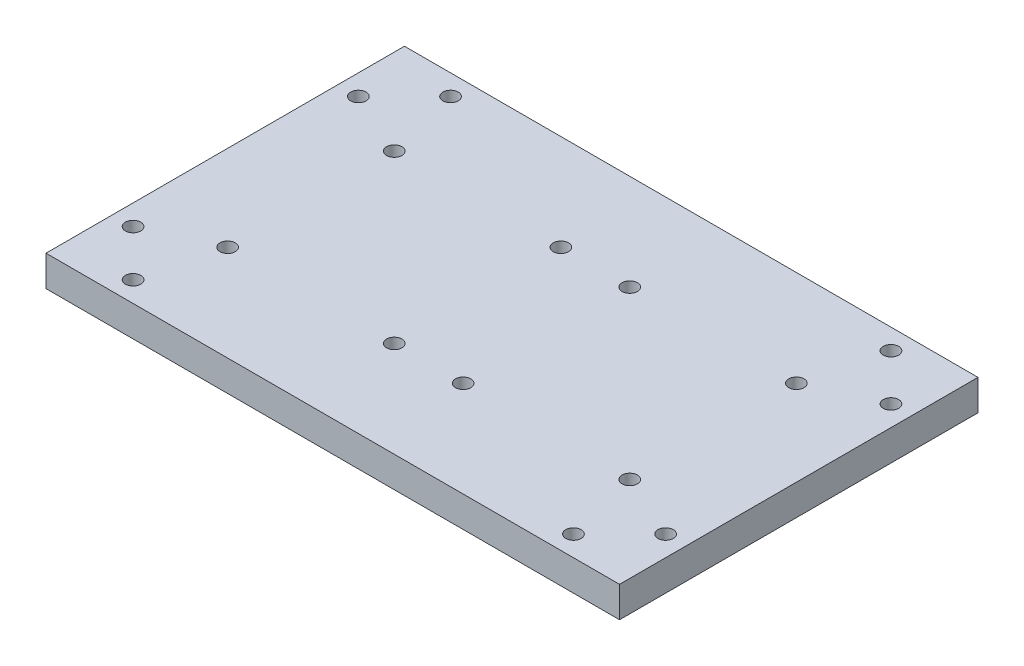
ISO-10303-21;
HEADER;
FILE_DESCRIPTION(('STEP AP214'),'2;1');
FILE_NAME('part.step','',(''),(''),'','','');
FILE_SCHEMA(('AUTOMOTIVE_DESIGN { 1 0 10303 214 1 1 1 1 }'));
ENDSEC;
DATA;
#1=APPLICATION_CONTEXT('core data for automotive mechanical design processes');
#2=APPLICATION_PROTOCOL_DEFINITION('international standard','automotive_design',2000,#1);
#3=PRODUCT_CONTEXT('',#1,'mechanical');
#4=PRODUCT('Part','Part','',(#3));
#5=PRODUCT_RELATED_PRODUCT_CATEGORY('part','',(#4));
#6=PRODUCT_DEFINITION_FORMATION('','',#4);
#7=PRODUCT_DEFINITION_CONTEXT('part definition',#1,'design');
#8=PRODUCT_DEFINITION('design','',#6,#7);
#9=PRODUCT_DEFINITION_SHAPE('','',#8);
#10=(LENGTH_UNIT() NAMED_UNIT(*) SI_UNIT(.MILLI.,.METRE.));
#11=(NAMED_UNIT(*) PLANE_ANGLE_UNIT() SI_UNIT($,.RADIAN.));
#12=(NAMED_UNIT(*) SI_UNIT($,.STERADIAN.) SOLID_ANGLE_UNIT());
#13=UNCERTAINTY_MEASURE_WITH_UNIT(LENGTH_MEASURE(1.E-05),#10,'distance_accuracy_value','');
#14=(GEOMETRIC_REPRESENTATION_CONTEXT(3) GLOBAL_UNCERTAINTY_ASSIGNED_CONTEXT((#13)) GLOBAL_UNIT_ASSIGNED_CONTEXT((#10,
#11,#12)) REPRESENTATION_CONTEXT('',''));
#15=CARTESIAN_POINT('',(0.,0.,0.));
#16=DIRECTION('',(0.,0.,1.));
#17=DIRECTION('',(1.,0.,0.));
#18=AXIS2_PLACEMENT_3D('',#15,#16,#17);
#19=CARTESIAN_POINT('',(0.,6.,0.));
#20=DIRECTION('',(1.,0.,0.));
#21=DIRECTION('',(0.,0.,-1.));
#22=AXIS2_PLACEMENT_3D('',#19,#20,#21);
#23=PLANE('',#22);
#24=DIRECTION('',(0.,0.,1.));
#25=VECTOR('',#24,1.);
#26=CARTESIAN_POINT('',(0.,0.,0.));
#27=LINE('',#26,#25);
#28=CARTESIAN_POINT('',(0.,0.,-70.));
#29=VERTEX_POINT('',#28);
#30=CARTESIAN_POINT('',(0.,0.,0.));
#31=VERTEX_POINT('',#30);
#32=EDGE_CURVE('E117',#29,#31,#27,.T.);
#33=ORIENTED_EDGE('',*,*,#32,.T.);
#34=DIRECTION('',(0.,-1.,0.));
#35=VECTOR('',#34,1.);
#36=CARTESIAN_POINT('',(0.,6.,0.));
#37=LINE('',#36,#35);
#38=CARTESIAN_POINT('',(0.,6.,0.));
#39=VERTEX_POINT('',#38);
#40=EDGE_CURVE('E11',#39,#31,#37,.T.);
#41=ORIENTED_EDGE('',*,*,#40,.F.);
#42=DIRECTION('',(0.,0.,1.));
#43=VECTOR('',#42,1.);
#44=CARTESIAN_POINT('',(0.,6.,0.));
#45=LINE('',#44,#43);
#46=CARTESIAN_POINT('',(0.,6.,-70.));
#47=VERTEX_POINT('',#46);
#48=EDGE_CURVE('E97',#47,#39,#45,.T.);
#49=ORIENTED_EDGE('',*,*,#48,.F.);
#50=DIRECTION('',(0.,-1.,0.));
#51=VECTOR('',#50,1.);
#52=CARTESIAN_POINT('',(0.,6.,-70.));
#53=LINE('',#52,#51);
#54=EDGE_CURVE('E115',#47,#29,#53,.T.);
#55=ORIENTED_EDGE('',*,*,#54,.T.);
#56=EDGE_LOOP('',(#33,#41,#49,#55));
#57=FACE_BOUND('',#56,.T.);
#58=ADVANCED_FACE('F44',(#57),#23,.F.);
#59=CARTESIAN_POINT('',(0.,6.,0.));
#60=DIRECTION('',(0.,0.,-1.));
#61=DIRECTION('',(-1.,0.,0.));
#62=AXIS2_PLACEMENT_3D('',#59,#60,#61);
#63=PLANE('',#62);
#64=DIRECTION('',(1.,0.,0.));
#65=VECTOR('',#64,1.);
#66=CARTESIAN_POINT('',(0.,0.,0.));
#67=LINE('',#66,#65);
#68=CARTESIAN_POINT('',(112.,0.,0.));
#69=VERTEX_POINT('',#68);
#70=EDGE_CURVE('E102',#31,#69,#67,.T.);
#71=ORIENTED_EDGE('',*,*,#70,.T.);
#72=DIRECTION('',(0.,-1.,0.));
#73=VECTOR('',#72,1.);
#74=CARTESIAN_POINT('',(112.,6.,0.));
#75=LINE('',#74,#73);
#76=CARTESIAN_POINT('',(112.,6.,0.));
#77=VERTEX_POINT('',#76);
#78=EDGE_CURVE('E54',#77,#69,#75,.T.);
#79=ORIENTED_EDGE('',*,*,#78,.F.);
#80=DIRECTION('',(1.,0.,0.));
#81=VECTOR('',#80,1.);
#82=CARTESIAN_POINT('',(0.,6.,0.));
#83=LINE('',#82,#81);
#84=EDGE_CURVE('E94',#39,#77,#83,.T.);
#85=ORIENTED_EDGE('',*,*,#84,.F.);
#86=ORIENTED_EDGE('',*,*,#40,.T.);
#87=EDGE_LOOP('',(#71,#79,#85,#86));
#88=FACE_BOUND('',#87,.T.);
#89=ADVANCED_FACE('F103',(#88),#63,.F.);
#90=CARTESIAN_POINT('',(112.,6.,0.));
#91=DIRECTION('',(-1.,0.,0.));
#92=DIRECTION('',(0.,0.,1.));
#93=AXIS2_PLACEMENT_3D('',#90,#91,#92);
#94=PLANE('',#93);
#95=DIRECTION('',(0.,0.,-1.));
#96=VECTOR('',#95,1.);
#97=CARTESIAN_POINT('',(112.,0.,0.));
#98=LINE('',#97,#96);
#99=CARTESIAN_POINT('',(112.,0.,-70.));
#100=VERTEX_POINT('',#99);
#101=EDGE_CURVE('E82',#69,#100,#98,.T.);
#102=ORIENTED_EDGE('',*,*,#101,.T.);
#103=DIRECTION('',(0.,-1.,0.));
#104=VECTOR('',#103,1.);
#105=CARTESIAN_POINT('',(112.,6.,-70.));
#106=LINE('',#105,#104);
#107=CARTESIAN_POINT('',(112.,6.,-70.));
#108=VERTEX_POINT('',#107);
#109=EDGE_CURVE('E106',#108,#100,#106,.T.);
#110=ORIENTED_EDGE('',*,*,#109,.F.);
#111=DIRECTION('',(0.,0.,-1.));
#112=VECTOR('',#111,1.);
#113=CARTESIAN_POINT('',(112.,6.,0.));
#114=LINE('',#113,#112);
#115=EDGE_CURVE('E100',#77,#108,#114,.T.);
#116=ORIENTED_EDGE('',*,*,#115,.F.);
#117=ORIENTED_EDGE('',*,*,#78,.T.);
#118=EDGE_LOOP('',(#102,#110,#116,#117));
#119=FACE_BOUND('',#118,.T.);
#120=ADVANCED_FACE('F107',(#119),#94,.F.);
#121=CARTESIAN_POINT('',(0.,6.,-70.));
#122=DIRECTION('',(0.,0.,1.));
#123=DIRECTION('',(1.,0.,0.));
#124=AXIS2_PLACEMENT_3D('',#121,#122,#123);
#125=PLANE('',#124);
#126=DIRECTION('',(-1.,0.,0.));
#127=VECTOR('',#126,1.);
#128=CARTESIAN_POINT('',(0.,0.,-70.));
#129=LINE('',#128,#127);
#130=EDGE_CURVE('E87',#100,#29,#129,.T.);
#131=ORIENTED_EDGE('',*,*,#130,.T.);
#132=ORIENTED_EDGE('',*,*,#54,.F.);
#133=DIRECTION('',(-1.,0.,0.));
#134=VECTOR('',#133,1.);
#135=CARTESIAN_POINT('',(0.,6.,-70.));
#136=LINE('',#135,#134);
#137=EDGE_CURVE('E61',#108,#47,#136,.T.);
#138=ORIENTED_EDGE('',*,*,#137,.F.);
#139=ORIENTED_EDGE('',*,*,#109,.T.);
#140=EDGE_LOOP('',(#131,#132,#138,#139));
#141=FACE_BOUND('',#140,.T.);
#142=ADVANCED_FACE('F269',(#141),#125,.F.);
#143=CARTESIAN_POINT('',(0.,6.,0.));
#144=DIRECTION('',(0.,-1.,0.));
#145=DIRECTION('',(0.,0.,-1.));
#146=AXIS2_PLACEMENT_3D('',#143,#144,#145);
#147=PLANE('',#146);
#148=CARTESIAN_POINT('',(13.,6.,-66.));
#149=DIRECTION('',(0.,1.,0.));
#150=DIRECTION('',(0.,0.,1.));
#151=AXIS2_PLACEMENT_3D('',#148,#149,#150);
#152=CIRCLE('',#151,1.5);
#153=CARTESIAN_POINT('',(13.,6.,-64.5));
#154=VERTEX_POINT('',#153);
#155=EDGE_CURVE('E237',#154,#154,#152,.T.);
#156=ORIENTED_EDGE('',*,*,#155,.F.);
#157=EDGE_LOOP('',(#156));
#158=FACE_BOUND('',#157,.T.);
#159=CARTESIAN_POINT('',(99.,6.,-66.));
#160=DIRECTION('',(0.,1.,0.));
#161=DIRECTION('',(0.,0.,-1.));
#162=AXIS2_PLACEMENT_3D('',#159,#160,#161);
#163=CIRCLE('',#162,1.50000000000001);
#164=CARTESIAN_POINT('',(99.,6.,-67.5));
#165=VERTEX_POINT('',#164);
#166=EDGE_CURVE('E247',#165,#165,#163,.T.);
#167=ORIENTED_EDGE('',*,*,#166,.F.);
#168=EDGE_LOOP('',(#167));
#169=FACE_BOUND('',#168,.T.);
#170=CARTESIAN_POINT('',(108.,6.,-57.));
#171=DIRECTION('',(0.,1.,0.));
#172=DIRECTION('',(0.,0.,-1.));
#173=AXIS2_PLACEMENT_3D('',#170,#171,#172);
#174=CIRCLE('',#173,1.50000000000001);
#175=CARTESIAN_POINT('',(108.,6.,-58.5));
#176=VERTEX_POINT('',#175);
#177=EDGE_CURVE('E242',#176,#176,#174,.T.);
#178=ORIENTED_EDGE('',*,*,#177,.F.);
#179=EDGE_LOOP('',(#178));
#180=FACE_BOUND('',#179,.T.);
#181=CARTESIAN_POINT('',(108.,6.,-13.));
#182=DIRECTION('',(0.,1.,0.));
#183=DIRECTION('',(0.,0.,1.));
#184=AXIS2_PLACEMENT_3D('',#181,#182,#183);
#185=CIRCLE('',#184,1.50000000000001);
#186=CARTESIAN_POINT('',(108.,6.,-11.5));
#187=VERTEX_POINT('',#186);
#188=EDGE_CURVE('E240',#187,#187,#185,.T.);
#189=ORIENTED_EDGE('',*,*,#188,.F.);
#190=EDGE_LOOP('',(#189));
#191=FACE_BOUND('',#190,.T.);
#192=CARTESIAN_POINT('',(99.,6.,-4.));
#193=DIRECTION('',(0.,1.,0.));
#194=DIRECTION('',(0.,0.,1.));
#195=AXIS2_PLACEMENT_3D('',#192,#193,#194);
#196=CIRCLE('',#195,1.50000000000001);
#197=CARTESIAN_POINT('',(99.,6.,-2.49999999999999));
#198=VERTEX_POINT('',#197);
#199=EDGE_CURVE('E245',#198,#198,#196,.T.);
#200=ORIENTED_EDGE('',*,*,#199,.F.);
#201=EDGE_LOOP('',(#200));
#202=FACE_BOUND('',#201,.T.);
#203=CARTESIAN_POINT('',(13.,6.,-4.));
#204=DIRECTION('',(0.,1.,0.));
#205=DIRECTION('',(0.,0.,-1.));
#206=AXIS2_PLACEMENT_3D('',#203,#204,#205);
#207=CIRCLE('',#206,1.5);
#208=CARTESIAN_POINT('',(13.,6.,-5.50000000000001));
#209=VERTEX_POINT('',#208);
#210=EDGE_CURVE('E260',#209,#209,#207,.T.);
#211=ORIENTED_EDGE('',*,*,#210,.F.);
#212=EDGE_LOOP('',(#211));
#213=FACE_BOUND('',#212,.T.);
#214=CARTESIAN_POINT('',(4.,6.,-13.));
#215=DIRECTION('',(0.,1.,0.));
#216=DIRECTION('',(0.,0.,-1.));
#217=AXIS2_PLACEMENT_3D('',#214,#215,#216);
#218=CIRCLE('',#217,1.5);
#219=CARTESIAN_POINT('',(4.,6.,-14.5));
#220=VERTEX_POINT('',#219);
#221=EDGE_CURVE('E251',#220,#220,#218,.T.);
#222=ORIENTED_EDGE('',*,*,#221,.F.);
#223=EDGE_LOOP('',(#222));
#224=FACE_BOUND('',#223,.T.);
#225=CARTESIAN_POINT('',(4.,6.,-57.));
#226=DIRECTION('',(0.,1.,0.));
#227=DIRECTION('',(0.,0.,1.));
#228=AXIS2_PLACEMENT_3D('',#225,#226,#227);
#229=CIRCLE('',#228,1.5);
#230=CARTESIAN_POINT('',(4.,6.,-55.5));
#231=VERTEX_POINT('',#230);
#232=EDGE_CURVE('E137',#231,#231,#229,.T.);
#233=ORIENTED_EDGE('',*,*,#232,.F.);
#234=EDGE_LOOP('',(#233));
#235=FACE_BOUND('',#234,.T.);
#236=CARTESIAN_POINT('',(16.735,6.,-18.735));
#237=DIRECTION('',(0.,1.,0.));
#238=DIRECTION('',(0.,0.,-1.));
#239=AXIS2_PLACEMENT_3D('',#236,#237,#238);
#240=CIRCLE('',#239,1.5);
#241=CARTESIAN_POINT('',(16.735,6.,-20.235));
#242=VERTEX_POINT('',#241);
#243=EDGE_CURVE('E187',#242,#242,#240,.T.);
#244=ORIENTED_EDGE('',*,*,#243,.F.);
#245=EDGE_LOOP('',(#244));
#246=FACE_BOUND('',#245,.T.);
#247=CARTESIAN_POINT('',(95.265,6.,-18.735));
#248=DIRECTION('',(0.,1.,0.));
#249=DIRECTION('',(0.,0.,1.));
#250=AXIS2_PLACEMENT_3D('',#247,#248,#249);
#251=CIRCLE('',#250,1.5);
#252=CARTESIAN_POINT('',(95.265,6.,-17.235));
#253=VERTEX_POINT('',#252);
#254=EDGE_CURVE('E180',#253,#253,#251,.T.);
#255=ORIENTED_EDGE('',*,*,#254,.F.);
#256=EDGE_LOOP('',(#255));
#257=FACE_BOUND('',#256,.T.);
#258=CARTESIAN_POINT('',(62.735,6.,-18.735));
#259=DIRECTION('',(0.,1.,0.));
#260=DIRECTION('',(0.,0.,1.));
#261=AXIS2_PLACEMENT_3D('',#258,#259,#260);
#262=CIRCLE('',#261,1.5);
#263=CARTESIAN_POINT('',(62.735,6.,-17.235));
#264=VERTEX_POINT('',#263);
#265=EDGE_CURVE('E204',#264,#264,#262,.T.);
#266=ORIENTED_EDGE('',*,*,#265,.F.);
#267=EDGE_LOOP('',(#266));
#268=FACE_BOUND('',#267,.T.);
#269=CARTESIAN_POINT('',(95.265,6.,-51.265));
#270=DIRECTION('',(0.,1.,0.));
#271=DIRECTION('',(0.,0.,1.));
#272=AXIS2_PLACEMENT_3D('',#269,#270,#271);
#273=CIRCLE('',#272,1.5);
#274=CARTESIAN_POINT('',(95.265,6.,-49.765));
#275=VERTEX_POINT('',#274);
#276=EDGE_CURVE('E191',#275,#275,#273,.T.);
#277=ORIENTED_EDGE('',*,*,#276,.F.);
#278=EDGE_LOOP('',(#277));
#279=FACE_BOUND('',#278,.T.);
#280=CARTESIAN_POINT('',(16.735,6.,-51.265));
#281=DIRECTION('',(0.,1.,0.));
#282=DIRECTION('',(0.,0.,-1.));
#283=AXIS2_PLACEMENT_3D('',#280,#281,#282);
#284=CIRCLE('',#283,1.5);
#285=CARTESIAN_POINT('',(16.735,6.,-52.765));
#286=VERTEX_POINT('',#285);
#287=EDGE_CURVE('E194',#286,#286,#284,.T.);
#288=ORIENTED_EDGE('',*,*,#287,.F.);
#289=EDGE_LOOP('',(#288));
#290=FACE_BOUND('',#289,.T.);
#291=CARTESIAN_POINT('',(49.265,6.,-51.265));
#292=DIRECTION('',(0.,1.,0.));
#293=DIRECTION('',(0.,0.,-1.));
#294=AXIS2_PLACEMENT_3D('',#291,#292,#293);
#295=CIRCLE('',#294,1.5);
#296=CARTESIAN_POINT('',(49.265,6.,-52.765));
#297=VERTEX_POINT('',#296);
#298=EDGE_CURVE('E221',#297,#297,#295,.T.);
#299=ORIENTED_EDGE('',*,*,#298,.F.);
#300=EDGE_LOOP('',(#299));
#301=FACE_BOUND('',#300,.T.);
#302=CARTESIAN_POINT('',(49.265,6.,-18.735));
#303=DIRECTION('',(0.,1.,0.));
#304=DIRECTION('',(0.,0.,-1.));
#305=AXIS2_PLACEMENT_3D('',#302,#303,#304);
#306=CIRCLE('',#305,1.5);
#307=CARTESIAN_POINT('',(49.265,6.,-20.235));
#308=VERTEX_POINT('',#307);
#309=EDGE_CURVE('E170',#308,#308,#306,.T.);
#310=ORIENTED_EDGE('',*,*,#309,.F.);
#311=EDGE_LOOP('',(#310));
#312=FACE_BOUND('',#311,.T.);
#313=CARTESIAN_POINT('',(62.735,6.,-51.265));
#314=DIRECTION('',(0.,1.,0.));
#315=DIRECTION('',(0.,0.,1.));
#316=AXIS2_PLACEMENT_3D('',#313,#314,#315);
#317=CIRCLE('',#316,1.5);
#318=CARTESIAN_POINT('',(62.735,6.,-49.765));
#319=VERTEX_POINT('',#318);
#320=EDGE_CURVE('E200',#319,#319,#317,.T.);
#321=ORIENTED_EDGE('',*,*,#320,.F.);
#322=EDGE_LOOP('',(#321));
#323=FACE_BOUND('',#322,.T.);
#324=ORIENTED_EDGE('',*,*,#48,.T.);
#325=ORIENTED_EDGE('',*,*,#84,.T.);
#326=ORIENTED_EDGE('',*,*,#115,.T.);
#327=ORIENTED_EDGE('',*,*,#137,.T.);
#328=EDGE_LOOP('',(#324,#325,#326,#327));
#329=FACE_BOUND('',#328,.T.);
#330=ADVANCED_FACE('F92',(#158,#169,#180,#191,#202,#213,#224,#235,#246,#257,#268,#279,#290,#301,
#312,#323,#329),#147,.F.);
#331=CARTESIAN_POINT('',(0.,0.,0.));
#332=DIRECTION('',(0.,-1.,0.));
#333=DIRECTION('',(0.,0.,-1.));
#334=AXIS2_PLACEMENT_3D('',#331,#332,#333);
#335=PLANE('',#334);
#336=CARTESIAN_POINT('',(13.,0.,-66.));
#337=DIRECTION('',(0.,-1.,0.));
#338=DIRECTION('',(0.,0.,-1.));
#339=AXIS2_PLACEMENT_3D('',#336,#337,#338);
#340=CIRCLE('',#339,1.5);
#341=CARTESIAN_POINT('',(13.,0.,-67.5));
#342=VERTEX_POINT('',#341);
#343=EDGE_CURVE('E48',#342,#342,#340,.T.);
#344=ORIENTED_EDGE('',*,*,#343,.F.);
#345=EDGE_LOOP('',(#344));
#346=FACE_BOUND('',#345,.T.);
#347=CARTESIAN_POINT('',(99.,0.,-66.));
#348=DIRECTION('',(0.,-1.,0.));
#349=DIRECTION('',(0.,0.,-1.));
#350=AXIS2_PLACEMENT_3D('',#347,#348,#349);
#351=CIRCLE('',#350,1.50000000000001);
#352=CARTESIAN_POINT('',(99.,0.,-67.5));
#353=VERTEX_POINT('',#352);
#354=EDGE_CURVE('E154',#353,#353,#351,.T.);
#355=ORIENTED_EDGE('',*,*,#354,.F.);
#356=EDGE_LOOP('',(#355));
#357=FACE_BOUND('',#356,.T.);
#358=CARTESIAN_POINT('',(108.,0.,-57.));
#359=DIRECTION('',(0.,-1.,0.));
#360=DIRECTION('',(0.,0.,-1.));
#361=AXIS2_PLACEMENT_3D('',#358,#359,#360);
#362=CIRCLE('',#361,1.50000000000001);
#363=CARTESIAN_POINT('',(108.,0.,-58.5));
#364=VERTEX_POINT('',#363);
#365=EDGE_CURVE('E155',#364,#364,#362,.T.);
#366=ORIENTED_EDGE('',*,*,#365,.F.);
#367=EDGE_LOOP('',(#366));
#368=FACE_BOUND('',#367,.T.);
#369=CARTESIAN_POINT('',(108.,0.,-13.));
#370=DIRECTION('',(0.,-1.,0.));
#371=DIRECTION('',(0.,0.,-1.));
#372=AXIS2_PLACEMENT_3D('',#369,#370,#371);
#373=CIRCLE('',#372,1.50000000000001);
#374=CARTESIAN_POINT('',(108.,0.,-14.5));
#375=VERTEX_POINT('',#374);
#376=EDGE_CURVE('E146',#375,#375,#373,.T.);
#377=ORIENTED_EDGE('',*,*,#376,.F.);
#378=EDGE_LOOP('',(#377));
#379=FACE_BOUND('',#378,.T.);
#380=CARTESIAN_POINT('',(99.,0.,-4.));
#381=DIRECTION('',(0.,-1.,0.));
#382=DIRECTION('',(0.,0.,-1.));
#383=AXIS2_PLACEMENT_3D('',#380,#381,#382);
#384=CIRCLE('',#383,1.50000000000001);
#385=CARTESIAN_POINT('',(99.,0.,-5.50000000000001));
#386=VERTEX_POINT('',#385);
#387=EDGE_CURVE('E145',#386,#386,#384,.T.);
#388=ORIENTED_EDGE('',*,*,#387,.F.);
#389=EDGE_LOOP('',(#388));
#390=FACE_BOUND('',#389,.T.);
#391=CARTESIAN_POINT('',(13.,0.,-4.));
#392=DIRECTION('',(0.,-1.,0.));
#393=DIRECTION('',(0.,0.,-1.));
#394=AXIS2_PLACEMENT_3D('',#391,#392,#393);
#395=CIRCLE('',#394,1.5);
#396=CARTESIAN_POINT('',(13.,0.,-5.50000000000001));
#397=VERTEX_POINT('',#396);
#398=EDGE_CURVE('E136',#397,#397,#395,.T.);
#399=ORIENTED_EDGE('',*,*,#398,.F.);
#400=EDGE_LOOP('',(#399));
#401=FACE_BOUND('',#400,.T.);
#402=CARTESIAN_POINT('',(4.,0.,-13.));
#403=DIRECTION('',(0.,-1.,0.));
#404=DIRECTION('',(0.,0.,-1.));
#405=AXIS2_PLACEMENT_3D('',#402,#403,#404);
#406=CIRCLE('',#405,1.5);
#407=CARTESIAN_POINT('',(4.,0.,-14.5));
#408=VERTEX_POINT('',#407);
#409=EDGE_CURVE('E133',#408,#408,#406,.T.);
#410=ORIENTED_EDGE('',*,*,#409,.F.);
#411=EDGE_LOOP('',(#410));
#412=FACE_BOUND('',#411,.T.);
#413=CARTESIAN_POINT('',(4.,0.,-57.));
#414=DIRECTION('',(0.,-1.,0.));
#415=DIRECTION('',(0.,0.,-1.));
#416=AXIS2_PLACEMENT_3D('',#413,#414,#415);
#417=CIRCLE('',#416,1.5);
#418=CARTESIAN_POINT('',(4.,0.,-58.5));
#419=VERTEX_POINT('',#418);
#420=EDGE_CURVE('E132',#419,#419,#417,.T.);
#421=ORIENTED_EDGE('',*,*,#420,.F.);
#422=EDGE_LOOP('',(#421));
#423=FACE_BOUND('',#422,.T.);
#424=CARTESIAN_POINT('',(16.735,0.,-18.735));
#425=DIRECTION('',(0.,1.,0.));
#426=DIRECTION('',(0.,0.,-1.));
#427=AXIS2_PLACEMENT_3D('',#424,#425,#426);
#428=CIRCLE('',#427,1.5);
#429=CARTESIAN_POINT('',(16.735,0.,-20.235));
#430=VERTEX_POINT('',#429);
#431=EDGE_CURVE('E188',#430,#430,#428,.T.);
#432=ORIENTED_EDGE('',*,*,#431,.T.);
#433=EDGE_LOOP('',(#432));
#434=FACE_BOUND('',#433,.T.);
#435=CARTESIAN_POINT('',(95.265,0.,-18.735));
#436=DIRECTION('',(0.,1.,0.));
#437=DIRECTION('',(0.,0.,1.));
#438=AXIS2_PLACEMENT_3D('',#435,#436,#437);
#439=CIRCLE('',#438,1.5);
#440=CARTESIAN_POINT('',(95.265,0.,-17.235));
#441=VERTEX_POINT('',#440);
#442=EDGE_CURVE('E185',#441,#441,#439,.T.);
#443=ORIENTED_EDGE('',*,*,#442,.T.);
#444=EDGE_LOOP('',(#443));
#445=FACE_BOUND('',#444,.T.);
#446=CARTESIAN_POINT('',(62.735,0.,-18.735));
#447=DIRECTION('',(0.,1.,0.));
#448=DIRECTION('',(0.,0.,1.));
#449=AXIS2_PLACEMENT_3D('',#446,#447,#448);
#450=CIRCLE('',#449,1.5);
#451=CARTESIAN_POINT('',(62.735,0.,-17.235));
#452=VERTEX_POINT('',#451);
#453=EDGE_CURVE('E182',#452,#452,#450,.T.);
#454=ORIENTED_EDGE('',*,*,#453,.T.);
#455=EDGE_LOOP('',(#454));
#456=FACE_BOUND('',#455,.T.);
#457=CARTESIAN_POINT('',(95.265,0.,-51.265));
#458=DIRECTION('',(0.,1.,0.));
#459=DIRECTION('',(0.,0.,1.));
#460=AXIS2_PLACEMENT_3D('',#457,#458,#459);
#461=CIRCLE('',#460,1.5);
#462=CARTESIAN_POINT('',(95.265,0.,-49.765));
#463=VERTEX_POINT('',#462);
#464=EDGE_CURVE('E199',#463,#463,#461,.T.);
#465=ORIENTED_EDGE('',*,*,#464,.T.);
#466=EDGE_LOOP('',(#465));
#467=FACE_BOUND('',#466,.T.);
#468=CARTESIAN_POINT('',(16.735,0.,-51.265));
#469=DIRECTION('',(0.,1.,0.));
#470=DIRECTION('',(0.,0.,-1.));
#471=AXIS2_PLACEMENT_3D('',#468,#469,#470);
#472=CIRCLE('',#471,1.5);
#473=CARTESIAN_POINT('',(16.735,0.,-52.765));
#474=VERTEX_POINT('',#473);
#475=EDGE_CURVE('E219',#474,#474,#472,.T.);
#476=ORIENTED_EDGE('',*,*,#475,.T.);
#477=EDGE_LOOP('',(#476));
#478=FACE_BOUND('',#477,.T.);
#479=CARTESIAN_POINT('',(49.265,0.,-51.265));
#480=DIRECTION('',(0.,1.,0.));
#481=DIRECTION('',(0.,0.,-1.));
#482=AXIS2_PLACEMENT_3D('',#479,#480,#481);
#483=CIRCLE('',#482,1.5);
#484=CARTESIAN_POINT('',(49.265,0.,-52.765));
#485=VERTEX_POINT('',#484);
#486=EDGE_CURVE('E174',#485,#485,#483,.T.);
#487=ORIENTED_EDGE('',*,*,#486,.T.);
#488=EDGE_LOOP('',(#487));
#489=FACE_BOUND('',#488,.T.);
#490=CARTESIAN_POINT('',(49.265,0.,-18.735));
#491=DIRECTION('',(0.,1.,0.));
#492=DIRECTION('',(0.,0.,-1.));
#493=AXIS2_PLACEMENT_3D('',#490,#491,#492);
#494=CIRCLE('',#493,1.5);
#495=CARTESIAN_POINT('',(49.265,0.,-20.235));
#496=VERTEX_POINT('',#495);
#497=EDGE_CURVE('E165',#496,#496,#494,.T.);
#498=ORIENTED_EDGE('',*,*,#497,.T.);
#499=EDGE_LOOP('',(#498));
#500=FACE_BOUND('',#499,.T.);
#501=CARTESIAN_POINT('',(62.735,0.,-51.265));
#502=DIRECTION('',(0.,1.,0.));
#503=DIRECTION('',(0.,0.,1.));
#504=AXIS2_PLACEMENT_3D('',#501,#502,#503);
#505=CIRCLE('',#504,1.5);
#506=CARTESIAN_POINT('',(62.735,0.,-49.765));
#507=VERTEX_POINT('',#506);
#508=EDGE_CURVE('E118',#507,#507,#505,.T.);
#509=ORIENTED_EDGE('',*,*,#508,.T.);
#510=EDGE_LOOP('',(#509));
#511=FACE_BOUND('',#510,.T.);
#512=ORIENTED_EDGE('',*,*,#32,.F.);
#513=ORIENTED_EDGE('',*,*,#130,.F.);
#514=ORIENTED_EDGE('',*,*,#101,.F.);
#515=ORIENTED_EDGE('',*,*,#70,.F.);
#516=EDGE_LOOP('',(#512,#513,#514,#515));
#517=FACE_BOUND('',#516,.T.);
#518=ADVANCED_FACE('F267',(#346,#357,#368,#379,#390,#401,#412,#423,#434,#445,#456,#467,#478,
#489,#500,#511,#517),#335,.T.);
#519=CARTESIAN_POINT('',(62.735,0.,-51.265));
#520=DIRECTION('',(0.,1.,0.));
#521=DIRECTION('',(0.,0.,1.));
#522=AXIS2_PLACEMENT_3D('',#519,#520,#521);
#523=CYLINDRICAL_SURFACE('',#522,1.5);
#524=ORIENTED_EDGE('',*,*,#508,.F.);
#525=EDGE_LOOP('',(#524));
#526=FACE_BOUND('',#525,.T.);
#527=ORIENTED_EDGE('',*,*,#320,.T.);
#528=EDGE_LOOP('',(#527));
#529=FACE_BOUND('',#528,.T.);
#530=ADVANCED_FACE('F293',(#526,#529),#523,.F.);
#531=CARTESIAN_POINT('',(49.265,0.,-18.735));
#532=DIRECTION('',(0.,1.,0.));
#533=DIRECTION('',(0.,0.,1.));
#534=AXIS2_PLACEMENT_3D('',#531,#532,#533);
#535=CYLINDRICAL_SURFACE('',#534,1.5);
#536=ORIENTED_EDGE('',*,*,#497,.F.);
#537=EDGE_LOOP('',(#536));
#538=FACE_BOUND('',#537,.T.);
#539=ORIENTED_EDGE('',*,*,#309,.T.);
#540=EDGE_LOOP('',(#539));
#541=FACE_BOUND('',#540,.T.);
#542=ADVANCED_FACE('F300',(#538,#541),#535,.F.);
#543=CARTESIAN_POINT('',(49.265,0.,-51.265));
#544=DIRECTION('',(0.,1.,0.));
#545=DIRECTION('',(0.,0.,1.));
#546=AXIS2_PLACEMENT_3D('',#543,#544,#545);
#547=CYLINDRICAL_SURFACE('',#546,1.5);
#548=ORIENTED_EDGE('',*,*,#486,.F.);
#549=EDGE_LOOP('',(#548));
#550=FACE_BOUND('',#549,.T.);
#551=ORIENTED_EDGE('',*,*,#298,.T.);
#552=EDGE_LOOP('',(#551));
#553=FACE_BOUND('',#552,.T.);
#554=ADVANCED_FACE('F304',(#550,#553),#547,.F.);
#555=CARTESIAN_POINT('',(16.735,0.,-51.265));
#556=DIRECTION('',(0.,1.,0.));
#557=DIRECTION('',(0.,0.,1.));
#558=AXIS2_PLACEMENT_3D('',#555,#556,#557);
#559=CYLINDRICAL_SURFACE('',#558,1.5);
#560=ORIENTED_EDGE('',*,*,#475,.F.);
#561=EDGE_LOOP('',(#560));
#562=FACE_BOUND('',#561,.T.);
#563=ORIENTED_EDGE('',*,*,#287,.T.);
#564=EDGE_LOOP('',(#563));
#565=FACE_BOUND('',#564,.T.);
#566=ADVANCED_FACE('F366',(#562,#565),#559,.F.);
#567=CARTESIAN_POINT('',(95.265,0.,-51.265));
#568=DIRECTION('',(0.,1.,0.));
#569=DIRECTION('',(0.,0.,1.));
#570=AXIS2_PLACEMENT_3D('',#567,#568,#569);
#571=CYLINDRICAL_SURFACE('',#570,1.5);
#572=ORIENTED_EDGE('',*,*,#464,.F.);
#573=EDGE_LOOP('',(#572));
#574=FACE_BOUND('',#573,.T.);
#575=ORIENTED_EDGE('',*,*,#276,.T.);
#576=EDGE_LOOP('',(#575));
#577=FACE_BOUND('',#576,.T.);
#578=ADVANCED_FACE('F380',(#574,#577),#571,.F.);
#579=CARTESIAN_POINT('',(62.735,0.,-18.735));
#580=DIRECTION('',(0.,1.,0.));
#581=DIRECTION('',(0.,0.,1.));
#582=AXIS2_PLACEMENT_3D('',#579,#580,#581);
#583=CYLINDRICAL_SURFACE('',#582,1.5);
#584=ORIENTED_EDGE('',*,*,#453,.F.);
#585=EDGE_LOOP('',(#584));
#586=FACE_BOUND('',#585,.T.);
#587=ORIENTED_EDGE('',*,*,#265,.T.);
#588=EDGE_LOOP('',(#587));
#589=FACE_BOUND('',#588,.T.);
#590=ADVANCED_FACE('F387',(#586,#589),#583,.F.);
#591=CARTESIAN_POINT('',(95.265,0.,-18.735));
#592=DIRECTION('',(0.,1.,0.));
#593=DIRECTION('',(0.,0.,1.));
#594=AXIS2_PLACEMENT_3D('',#591,#592,#593);
#595=CYLINDRICAL_SURFACE('',#594,1.5);
#596=ORIENTED_EDGE('',*,*,#442,.F.);
#597=EDGE_LOOP('',(#596));
#598=FACE_BOUND('',#597,.T.);
#599=ORIENTED_EDGE('',*,*,#254,.T.);
#600=EDGE_LOOP('',(#599));
#601=FACE_BOUND('',#600,.T.);
#602=ADVANCED_FACE('F393',(#598,#601),#595,.F.);
#603=CARTESIAN_POINT('',(16.735,0.,-18.735));
#604=DIRECTION('',(0.,1.,0.));
#605=DIRECTION('',(0.,0.,1.));
#606=AXIS2_PLACEMENT_3D('',#603,#604,#605);
#607=CYLINDRICAL_SURFACE('',#606,1.5);
#608=ORIENTED_EDGE('',*,*,#431,.F.);
#609=EDGE_LOOP('',(#608));
#610=FACE_BOUND('',#609,.T.);
#611=ORIENTED_EDGE('',*,*,#243,.T.);
#612=EDGE_LOOP('',(#611));
#613=FACE_BOUND('',#612,.T.);
#614=ADVANCED_FACE('F401',(#610,#613),#607,.F.);
#615=CARTESIAN_POINT('',(4.,-4.,-57.));
#616=DIRECTION('',(0.,1.,0.));
#617=DIRECTION('',(0.,0.,1.));
#618=AXIS2_PLACEMENT_3D('',#615,#616,#617);
#619=CYLINDRICAL_SURFACE('',#618,1.5);
#620=ORIENTED_EDGE('',*,*,#420,.T.);
#621=EDGE_LOOP('',(#620));
#622=FACE_BOUND('',#621,.T.);
#623=ORIENTED_EDGE('',*,*,#232,.T.);
#624=EDGE_LOOP('',(#623));
#625=FACE_BOUND('',#624,.T.);
#626=ADVANCED_FACE('F415',(#622,#625),#619,.F.);
#627=CARTESIAN_POINT('',(4.,-4.,-13.));
#628=DIRECTION('',(0.,1.,0.));
#629=DIRECTION('',(0.,0.,1.));
#630=AXIS2_PLACEMENT_3D('',#627,#628,#629);
#631=CYLINDRICAL_SURFACE('',#630,1.5);
#632=ORIENTED_EDGE('',*,*,#409,.T.);
#633=EDGE_LOOP('',(#632));
#634=FACE_BOUND('',#633,.T.);
#635=ORIENTED_EDGE('',*,*,#221,.T.);
#636=EDGE_LOOP('',(#635));
#637=FACE_BOUND('',#636,.T.);
#638=ADVANCED_FACE('F423',(#634,#637),#631,.F.);
#639=CARTESIAN_POINT('',(13.,-4.,-4.));
#640=DIRECTION('',(0.,1.,0.));
#641=DIRECTION('',(0.,0.,1.));
#642=AXIS2_PLACEMENT_3D('',#639,#640,#641);
#643=CYLINDRICAL_SURFACE('',#642,1.5);
#644=ORIENTED_EDGE('',*,*,#398,.T.);
#645=EDGE_LOOP('',(#644));
#646=FACE_BOUND('',#645,.T.);
#647=ORIENTED_EDGE('',*,*,#210,.T.);
#648=EDGE_LOOP('',(#647));
#649=FACE_BOUND('',#648,.T.);
#650=ADVANCED_FACE('F429',(#646,#649),#643,.F.);
#651=CARTESIAN_POINT('',(99.,-4.,-4.));
#652=DIRECTION('',(0.,1.,0.));
#653=DIRECTION('',(0.,0.,1.));
#654=AXIS2_PLACEMENT_3D('',#651,#652,#653);
#655=CYLINDRICAL_SURFACE('',#654,1.50000000000001);
#656=ORIENTED_EDGE('',*,*,#387,.T.);
#657=EDGE_LOOP('',(#656));
#658=FACE_BOUND('',#657,.T.);
#659=ORIENTED_EDGE('',*,*,#199,.T.);
#660=EDGE_LOOP('',(#659));
#661=FACE_BOUND('',#660,.T.);
#662=ADVANCED_FACE('F264',(#658,#661),#655,.F.);
#663=CARTESIAN_POINT('',(108.,-4.,-13.));
#664=DIRECTION('',(0.,1.,0.));
#665=DIRECTION('',(0.,0.,1.));
#666=AXIS2_PLACEMENT_3D('',#663,#664,#665);
#667=CYLINDRICAL_SURFACE('',#666,1.50000000000001);
#668=ORIENTED_EDGE('',*,*,#376,.T.);
#669=EDGE_LOOP('',(#668));
#670=FACE_BOUND('',#669,.T.);
#671=ORIENTED_EDGE('',*,*,#188,.T.);
#672=EDGE_LOOP('',(#671));
#673=FACE_BOUND('',#672,.T.);
#674=ADVANCED_FACE('F450',(#670,#673),#667,.F.);
#675=CARTESIAN_POINT('',(108.,-4.,-57.));
#676=DIRECTION('',(0.,1.,0.));
#677=DIRECTION('',(0.,0.,1.));
#678=AXIS2_PLACEMENT_3D('',#675,#676,#677);
#679=CYLINDRICAL_SURFACE('',#678,1.50000000000001);
#680=ORIENTED_EDGE('',*,*,#365,.T.);
#681=EDGE_LOOP('',(#680));
#682=FACE_BOUND('',#681,.T.);
#683=ORIENTED_EDGE('',*,*,#177,.T.);
#684=EDGE_LOOP('',(#683));
#685=FACE_BOUND('',#684,.T.);
#686=ADVANCED_FACE('F457',(#682,#685),#679,.F.);
#687=CARTESIAN_POINT('',(99.,-4.,-66.));
#688=DIRECTION('',(0.,1.,0.));
#689=DIRECTION('',(0.,0.,1.));
#690=AXIS2_PLACEMENT_3D('',#687,#688,#689);
#691=CYLINDRICAL_SURFACE('',#690,1.50000000000001);
#692=ORIENTED_EDGE('',*,*,#354,.T.);
#693=EDGE_LOOP('',(#692));
#694=FACE_BOUND('',#693,.T.);
#695=ORIENTED_EDGE('',*,*,#166,.T.);
#696=EDGE_LOOP('',(#695));
#697=FACE_BOUND('',#696,.T.);
#698=ADVANCED_FACE('F463',(#694,#697),#691,.F.);
#699=CARTESIAN_POINT('',(13.,-4.,-66.));
#700=DIRECTION('',(0.,1.,0.));
#701=DIRECTION('',(0.,0.,1.));
#702=AXIS2_PLACEMENT_3D('',#699,#700,#701);
#703=CYLINDRICAL_SURFACE('',#702,1.5);
#704=ORIENTED_EDGE('',*,*,#343,.T.);
#705=EDGE_LOOP('',(#704));
#706=FACE_BOUND('',#705,.T.);
#707=ORIENTED_EDGE('',*,*,#155,.T.);
#708=EDGE_LOOP('',(#707));
#709=FACE_BOUND('',#708,.T.);
#710=ADVANCED_FACE('F475',(#706,#709),#703,.F.);
#711=CLOSED_SHELL('',(#58,#89,#120,#142,#330,#518,#530,#542,#554,#566,#578,#590,#602,#614,#626,
#638,#650,#662,#674,#686,#698,#710));
#712=MANIFOLD_SOLID_BREP('B2',#711);
#713=ADVANCED_BREP_SHAPE_REPRESENTATION('',(#18,#712),#14);
#714=SHAPE_DEFINITION_REPRESENTATION(#9,#713);
ENDSEC;
END-ISO-10303-21;
